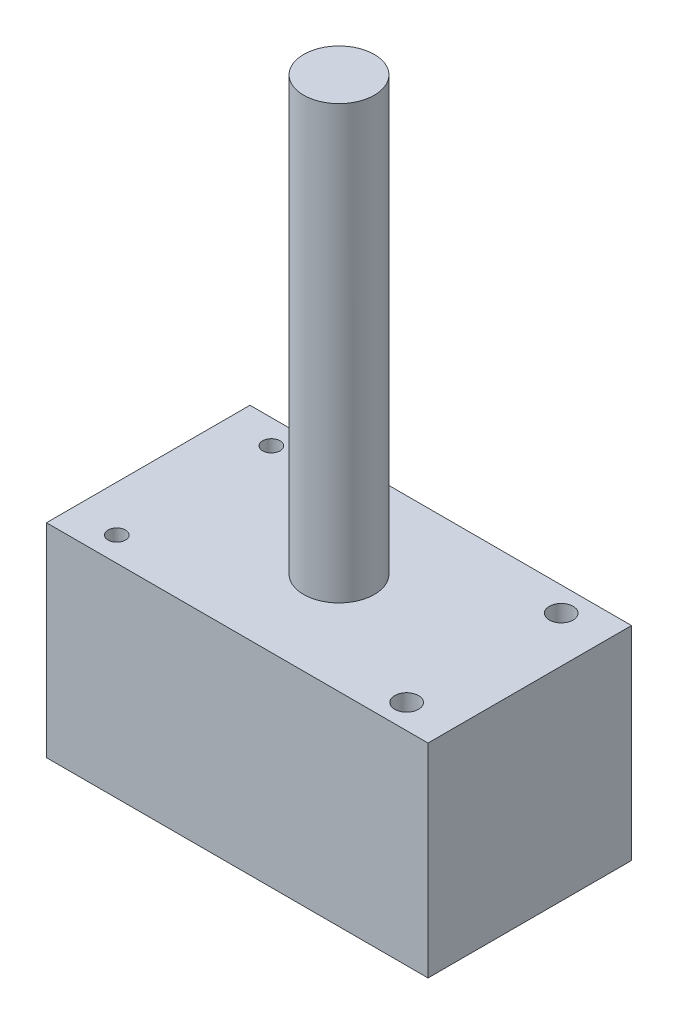
ISO-10303-21;
HEADER;
FILE_DESCRIPTION(('STEP AP214'),'2;1');
FILE_NAME('part.step','',(''),(''),'','','');
FILE_SCHEMA(('AUTOMOTIVE_DESIGN { 1 0 10303 214 1 1 1 1 }'));
ENDSEC;
DATA;
#1=APPLICATION_CONTEXT('core data for automotive mechanical design processes');
#2=APPLICATION_PROTOCOL_DEFINITION('international standard','automotive_design',2000,#1);
#3=PRODUCT_CONTEXT('',#1,'mechanical');
#4=PRODUCT('Part','Part','',(#3));
#5=PRODUCT_RELATED_PRODUCT_CATEGORY('part','',(#4));
#6=PRODUCT_DEFINITION_FORMATION('','',#4);
#7=PRODUCT_DEFINITION_CONTEXT('part definition',#1,'design');
#8=PRODUCT_DEFINITION('design','',#6,#7);
#9=PRODUCT_DEFINITION_SHAPE('','',#8);
#10=(LENGTH_UNIT() NAMED_UNIT(*) SI_UNIT(.MILLI.,.METRE.));
#11=(NAMED_UNIT(*) PLANE_ANGLE_UNIT() SI_UNIT($,.RADIAN.));
#12=(NAMED_UNIT(*) SI_UNIT($,.STERADIAN.) SOLID_ANGLE_UNIT());
#13=UNCERTAINTY_MEASURE_WITH_UNIT(LENGTH_MEASURE(1.E-05),#10,'distance_accuracy_value','');
#14=(GEOMETRIC_REPRESENTATION_CONTEXT(3) GLOBAL_UNCERTAINTY_ASSIGNED_CONTEXT((#13)) GLOBAL_UNIT_ASSIGNED_CONTEXT((#10,
#11,#12)) REPRESENTATION_CONTEXT('',''));
#15=CARTESIAN_POINT('',(0.,0.,0.));
#16=DIRECTION('',(0.,0.,1.));
#17=DIRECTION('',(1.,0.,0.));
#18=AXIS2_PLACEMENT_3D('',#15,#16,#17);
#19=CARTESIAN_POINT('',(0.,72.,0.));
#20=DIRECTION('',(0.,-1.,0.));
#21=DIRECTION('',(0.,0.,-1.));
#22=AXIS2_PLACEMENT_3D('',#19,#20,#21);
#23=PLANE('',#22);
#24=CARTESIAN_POINT('',(0.,72.,0.));
#25=DIRECTION('',(0.,-1.,0.));
#26=DIRECTION('',(0.,0.,-1.));
#27=AXIS2_PLACEMENT_3D('',#24,#25,#26);
#28=CIRCLE('',#27,12.5);
#29=CARTESIAN_POINT('',(0.,72.,-12.5));
#30=VERTEX_POINT('',#29);
#31=EDGE_CURVE('E11',#30,#30,#28,.F.);
#32=ORIENTED_EDGE('',*,*,#31,.F.);
#33=EDGE_LOOP('',(#32));
#34=FACE_BOUND('',#33,.T.);
#35=DIRECTION('',(0.,0.,-1.));
#36=VECTOR('',#35,1.);
#37=CARTESIAN_POINT('',(67.5,72.,36.));
#38=LINE('',#37,#36);
#39=CARTESIAN_POINT('',(67.5,72.,36.));
#40=VERTEX_POINT('',#39);
#41=CARTESIAN_POINT('',(67.5,72.,-36.));
#42=VERTEX_POINT('',#41);
#43=EDGE_CURVE('E93',#40,#42,#38,.T.);
#44=ORIENTED_EDGE('',*,*,#43,.T.);
#45=DIRECTION('',(-1.,0.,0.));
#46=VECTOR('',#45,1.);
#47=CARTESIAN_POINT('',(-67.5,72.,-36.));
#48=LINE('',#47,#46);
#49=CARTESIAN_POINT('',(-67.5,72.,-36.));
#50=VERTEX_POINT('',#49);
#51=EDGE_CURVE('E88',#42,#50,#48,.T.);
#52=ORIENTED_EDGE('',*,*,#51,.T.);
#53=DIRECTION('',(0.,0.,1.));
#54=VECTOR('',#53,1.);
#55=CARTESIAN_POINT('',(-67.5,72.,36.));
#56=LINE('',#55,#54);
#57=CARTESIAN_POINT('',(-67.5,72.,36.));
#58=VERTEX_POINT('',#57);
#59=EDGE_CURVE('E91',#50,#58,#56,.T.);
#60=ORIENTED_EDGE('',*,*,#59,.T.);
#61=DIRECTION('',(1.,0.,0.));
#62=VECTOR('',#61,1.);
#63=CARTESIAN_POINT('',(-67.5,72.,36.));
#64=LINE('',#63,#62);
#65=EDGE_CURVE('E57',#58,#40,#64,.T.);
#66=ORIENTED_EDGE('',*,*,#65,.T.);
#67=EDGE_LOOP('',(#44,#52,#60,#66));
#68=FACE_BOUND('',#67,.T.);
#69=CARTESIAN_POINT('',(-51.280276816609,72.,27.3494809688581));
#70=DIRECTION('',(0.,1.,0.));
#71=DIRECTION('',(0.,0.,1.));
#72=AXIS2_PLACEMENT_3D('',#69,#70,#71);
#73=CIRCLE('',#72,3.09047537804198);
#74=CARTESIAN_POINT('',(-51.280276816609,72.,30.4399563469001));
#75=VERTEX_POINT('',#74);
#76=EDGE_CURVE('E109',#75,#75,#73,.T.);
#77=ORIENTED_EDGE('',*,*,#76,.F.);
#78=EDGE_LOOP('',(#77));
#79=FACE_BOUND('',#78,.T.);
#80=CARTESIAN_POINT('',(51.2802768166091,72.,27.3494809688581));
#81=DIRECTION('',(0.,1.,0.));
#82=DIRECTION('',(0.,0.,1.));
#83=AXIS2_PLACEMENT_3D('',#80,#81,#82);
#84=CIRCLE('',#83,4.2197231833909);
#85=CARTESIAN_POINT('',(51.2802768166091,72.,31.569204152249));
#86=VERTEX_POINT('',#85);
#87=EDGE_CURVE('E124',#86,#86,#84,.T.);
#88=ORIENTED_EDGE('',*,*,#87,.F.);
#89=EDGE_LOOP('',(#88));
#90=FACE_BOUND('',#89,.T.);
#91=CARTESIAN_POINT('',(-51.280276816609,72.,-27.3494809688581));
#92=DIRECTION('',(0.,1.,0.));
#93=DIRECTION('',(0.,0.,1.));
#94=AXIS2_PLACEMENT_3D('',#91,#92,#93);
#95=CIRCLE('',#94,3.09047537804198);
#96=CARTESIAN_POINT('',(-51.280276816609,72.,-24.2590055908161));
#97=VERTEX_POINT('',#96);
#98=EDGE_CURVE('E130',#97,#97,#95,.T.);
#99=ORIENTED_EDGE('',*,*,#98,.F.);
#100=EDGE_LOOP('',(#99));
#101=FACE_BOUND('',#100,.T.);
#102=CARTESIAN_POINT('',(51.2802768166091,72.,-27.3494809688582));
#103=DIRECTION('',(0.,1.,0.));
#104=DIRECTION('',(0.,0.,1.));
#105=AXIS2_PLACEMENT_3D('',#102,#103,#104);
#106=CIRCLE('',#105,4.2197231833909);
#107=CARTESIAN_POINT('',(51.2802768166091,72.,-23.1297577854673));
#108=VERTEX_POINT('',#107);
#109=EDGE_CURVE('E136',#108,#108,#106,.T.);
#110=ORIENTED_EDGE('',*,*,#109,.F.);
#111=EDGE_LOOP('',(#110));
#112=FACE_BOUND('',#111,.T.);
#113=ADVANCED_FACE('F39',(#34,#68,#79,#90,#101,#112),#23,.F.);
#114=CARTESIAN_POINT('',(0.,0.,0.));
#115=DIRECTION('',(0.,-1.,0.));
#116=DIRECTION('',(0.,0.,-1.));
#117=AXIS2_PLACEMENT_3D('',#114,#115,#116);
#118=PLANE('',#117);
#119=CARTESIAN_POINT('',(-51.280276816609,0.,-27.3494809688581));
#120=DIRECTION('',(0.,1.,0.));
#121=DIRECTION('',(0.,0.,1.));
#122=AXIS2_PLACEMENT_3D('',#119,#120,#121);
#123=CIRCLE('',#122,3.09047537804198);
#124=CARTESIAN_POINT('',(-51.280276816609,0.,-24.2590055908161));
#125=VERTEX_POINT('',#124);
#126=EDGE_CURVE('E133',#125,#125,#123,.T.);
#127=ORIENTED_EDGE('',*,*,#126,.T.);
#128=EDGE_LOOP('',(#127));
#129=FACE_BOUND('',#128,.T.);
#130=CARTESIAN_POINT('',(-51.280276816609,0.,27.3494809688581));
#131=DIRECTION('',(0.,1.,0.));
#132=DIRECTION('',(0.,0.,1.));
#133=AXIS2_PLACEMENT_3D('',#130,#131,#132);
#134=CIRCLE('',#133,3.09047537804198);
#135=CARTESIAN_POINT('',(-51.280276816609,0.,30.4399563469001));
#136=VERTEX_POINT('',#135);
#137=EDGE_CURVE('E121',#136,#136,#134,.T.);
#138=ORIENTED_EDGE('',*,*,#137,.T.);
#139=EDGE_LOOP('',(#138));
#140=FACE_BOUND('',#139,.T.);
#141=DIRECTION('',(0.,0.,-1.));
#142=VECTOR('',#141,1.);
#143=CARTESIAN_POINT('',(67.5,0.,36.));
#144=LINE('',#143,#142);
#145=CARTESIAN_POINT('',(67.5,0.,36.));
#146=VERTEX_POINT('',#145);
#147=CARTESIAN_POINT('',(67.5,0.,-36.));
#148=VERTEX_POINT('',#147);
#149=EDGE_CURVE('E106',#146,#148,#144,.T.);
#150=ORIENTED_EDGE('',*,*,#149,.F.);
#151=DIRECTION('',(1.,0.,0.));
#152=VECTOR('',#151,1.);
#153=CARTESIAN_POINT('',(-67.5,0.,36.));
#154=LINE('',#153,#152);
#155=CARTESIAN_POINT('',(-67.5,0.,36.));
#156=VERTEX_POINT('',#155);
#157=EDGE_CURVE('E80',#156,#146,#154,.T.);
#158=ORIENTED_EDGE('',*,*,#157,.F.);
#159=DIRECTION('',(0.,0.,1.));
#160=VECTOR('',#159,1.);
#161=CARTESIAN_POINT('',(-67.5,0.,36.));
#162=LINE('',#161,#160);
#163=CARTESIAN_POINT('',(-67.5,0.,-36.));
#164=VERTEX_POINT('',#163);
#165=EDGE_CURVE('E74',#164,#156,#162,.T.);
#166=ORIENTED_EDGE('',*,*,#165,.F.);
#167=DIRECTION('',(-1.,0.,0.));
#168=VECTOR('',#167,1.);
#169=CARTESIAN_POINT('',(-67.5,0.,-36.));
#170=LINE('',#169,#168);
#171=EDGE_CURVE('E98',#148,#164,#170,.T.);
#172=ORIENTED_EDGE('',*,*,#171,.F.);
#173=EDGE_LOOP('',(#150,#158,#166,#172));
#174=FACE_BOUND('',#173,.T.);
#175=CARTESIAN_POINT('',(51.2802768166091,0.,27.3494809688581));
#176=DIRECTION('',(0.,1.,0.));
#177=DIRECTION('',(0.,0.,1.));
#178=AXIS2_PLACEMENT_3D('',#175,#176,#177);
#179=CIRCLE('',#178,4.2197231833909);
#180=CARTESIAN_POINT('',(51.2802768166091,0.,31.569204152249));
#181=VERTEX_POINT('',#180);
#182=EDGE_CURVE('E127',#181,#181,#179,.T.);
#183=ORIENTED_EDGE('',*,*,#182,.T.);
#184=EDGE_LOOP('',(#183));
#185=FACE_BOUND('',#184,.T.);
#186=CARTESIAN_POINT('',(51.2802768166091,0.,-27.3494809688582));
#187=DIRECTION('',(0.,1.,0.));
#188=DIRECTION('',(0.,0.,1.));
#189=AXIS2_PLACEMENT_3D('',#186,#187,#188);
#190=CIRCLE('',#189,4.2197231833909);
#191=CARTESIAN_POINT('',(51.2802768166091,0.,-23.1297577854673));
#192=VERTEX_POINT('',#191);
#193=EDGE_CURVE('E139',#192,#192,#190,.T.);
#194=ORIENTED_EDGE('',*,*,#193,.T.);
#195=EDGE_LOOP('',(#194));
#196=FACE_BOUND('',#195,.T.);
#197=ADVANCED_FACE('F117',(#129,#140,#174,#185,#196),#118,.T.);
#198=CARTESIAN_POINT('',(67.5,72.,36.));
#199=DIRECTION('',(-1.,0.,0.));
#200=DIRECTION('',(0.,0.,1.));
#201=AXIS2_PLACEMENT_3D('',#198,#199,#200);
#202=PLANE('',#201);
#203=ORIENTED_EDGE('',*,*,#149,.T.);
#204=DIRECTION('',(0.,-1.,0.));
#205=VECTOR('',#204,1.);
#206=CARTESIAN_POINT('',(67.5,72.,-36.));
#207=LINE('',#206,#205);
#208=EDGE_CURVE('E43',#42,#148,#207,.T.);
#209=ORIENTED_EDGE('',*,*,#208,.F.);
#210=ORIENTED_EDGE('',*,*,#43,.F.);
#211=DIRECTION('',(0.,-1.,0.));
#212=VECTOR('',#211,1.);
#213=CARTESIAN_POINT('',(67.5,72.,36.));
#214=LINE('',#213,#212);
#215=EDGE_CURVE('E102',#40,#146,#214,.T.);
#216=ORIENTED_EDGE('',*,*,#215,.T.);
#217=EDGE_LOOP('',(#203,#209,#210,#216));
#218=FACE_BOUND('',#217,.T.);
#219=ADVANCED_FACE('F41',(#218),#202,.F.);
#220=CARTESIAN_POINT('',(-67.5,72.,-36.));
#221=DIRECTION('',(0.,0.,1.));
#222=DIRECTION('',(1.,0.,0.));
#223=AXIS2_PLACEMENT_3D('',#220,#221,#222);
#224=PLANE('',#223);
#225=ORIENTED_EDGE('',*,*,#171,.T.);
#226=DIRECTION('',(0.,-1.,0.));
#227=VECTOR('',#226,1.);
#228=CARTESIAN_POINT('',(-67.5,72.,-36.));
#229=LINE('',#228,#227);
#230=EDGE_CURVE('E96',#50,#164,#229,.T.);
#231=ORIENTED_EDGE('',*,*,#230,.F.);
#232=ORIENTED_EDGE('',*,*,#51,.F.);
#233=ORIENTED_EDGE('',*,*,#208,.T.);
#234=EDGE_LOOP('',(#225,#231,#232,#233));
#235=FACE_BOUND('',#234,.T.);
#236=ADVANCED_FACE('F97',(#235),#224,.F.);
#237=CARTESIAN_POINT('',(-67.5,72.,36.));
#238=DIRECTION('',(1.,0.,0.));
#239=DIRECTION('',(0.,0.,-1.));
#240=AXIS2_PLACEMENT_3D('',#237,#238,#239);
#241=PLANE('',#240);
#242=ORIENTED_EDGE('',*,*,#165,.T.);
#243=DIRECTION('',(0.,-1.,0.));
#244=VECTOR('',#243,1.);
#245=CARTESIAN_POINT('',(-67.5,72.,36.));
#246=LINE('',#245,#244);
#247=EDGE_CURVE('E99',#58,#156,#246,.T.);
#248=ORIENTED_EDGE('',*,*,#247,.F.);
#249=ORIENTED_EDGE('',*,*,#59,.F.);
#250=ORIENTED_EDGE('',*,*,#230,.T.);
#251=EDGE_LOOP('',(#242,#248,#249,#250));
#252=FACE_BOUND('',#251,.T.);
#253=ADVANCED_FACE('F100',(#252),#241,.F.);
#254=CARTESIAN_POINT('',(-67.5,72.,36.));
#255=DIRECTION('',(0.,0.,-1.));
#256=DIRECTION('',(-1.,0.,0.));
#257=AXIS2_PLACEMENT_3D('',#254,#255,#256);
#258=PLANE('',#257);
#259=ORIENTED_EDGE('',*,*,#157,.T.);
#260=ORIENTED_EDGE('',*,*,#215,.F.);
#261=ORIENTED_EDGE('',*,*,#65,.F.);
#262=ORIENTED_EDGE('',*,*,#247,.T.);
#263=EDGE_LOOP('',(#259,#260,#261,#262));
#264=FACE_BOUND('',#263,.T.);
#265=ADVANCED_FACE('F114',(#264),#258,.F.);
#266=CARTESIAN_POINT('',(-51.280276816609,72.,27.3494809688581));
#267=DIRECTION('',(0.,-1.,0.));
#268=DIRECTION('',(0.,0.,-1.));
#269=AXIS2_PLACEMENT_3D('',#266,#267,#268);
#270=CYLINDRICAL_SURFACE('',#269,3.09047537804198);
#271=ORIENTED_EDGE('',*,*,#76,.T.);
#272=EDGE_LOOP('',(#271));
#273=FACE_BOUND('',#272,.T.);
#274=ORIENTED_EDGE('',*,*,#137,.F.);
#275=EDGE_LOOP('',(#274));
#276=FACE_BOUND('',#275,.T.);
#277=ADVANCED_FACE('F165',(#273,#276),#270,.F.);
#278=CARTESIAN_POINT('',(51.2802768166091,72.,27.3494809688581));
#279=DIRECTION('',(0.,-1.,0.));
#280=DIRECTION('',(0.,0.,-1.));
#281=AXIS2_PLACEMENT_3D('',#278,#279,#280);
#282=CYLINDRICAL_SURFACE('',#281,4.2197231833909);
#283=ORIENTED_EDGE('',*,*,#87,.T.);
#284=EDGE_LOOP('',(#283));
#285=FACE_BOUND('',#284,.T.);
#286=ORIENTED_EDGE('',*,*,#182,.F.);
#287=EDGE_LOOP('',(#286));
#288=FACE_BOUND('',#287,.T.);
#289=ADVANCED_FACE('F221',(#285,#288),#282,.F.);
#290=CARTESIAN_POINT('',(-51.280276816609,72.,-27.3494809688581));
#291=DIRECTION('',(0.,-1.,0.));
#292=DIRECTION('',(0.,0.,-1.));
#293=AXIS2_PLACEMENT_3D('',#290,#291,#292);
#294=CYLINDRICAL_SURFACE('',#293,3.09047537804198);
#295=ORIENTED_EDGE('',*,*,#98,.T.);
#296=EDGE_LOOP('',(#295));
#297=FACE_BOUND('',#296,.T.);
#298=ORIENTED_EDGE('',*,*,#126,.F.);
#299=EDGE_LOOP('',(#298));
#300=FACE_BOUND('',#299,.T.);
#301=ADVANCED_FACE('F212',(#297,#300),#294,.F.);
#302=CARTESIAN_POINT('',(51.2802768166091,72.,-27.3494809688582));
#303=DIRECTION('',(0.,-1.,0.));
#304=DIRECTION('',(0.,0.,-1.));
#305=AXIS2_PLACEMENT_3D('',#302,#303,#304);
#306=CYLINDRICAL_SURFACE('',#305,4.2197231833909);
#307=ORIENTED_EDGE('',*,*,#109,.T.);
#308=EDGE_LOOP('',(#307));
#309=FACE_BOUND('',#308,.T.);
#310=ORIENTED_EDGE('',*,*,#193,.F.);
#311=EDGE_LOOP('',(#310));
#312=FACE_BOUND('',#311,.T.);
#313=ADVANCED_FACE('F153',(#309,#312),#306,.F.);
#314=CARTESIAN_POINT('',(0.,225.,0.));
#315=DIRECTION('',(0.,-1.,0.));
#316=DIRECTION('',(0.,0.,-1.));
#317=AXIS2_PLACEMENT_3D('',#314,#315,#316);
#318=CYLINDRICAL_SURFACE('',#317,12.5);
#319=CARTESIAN_POINT('',(0.,225.,0.));
#320=DIRECTION('',(0.,1.,0.));
#321=DIRECTION('',(0.,0.,1.));
#322=AXIS2_PLACEMENT_3D('',#319,#320,#321);
#323=CIRCLE('',#322,12.5);
#324=CARTESIAN_POINT('',(0.,225.,12.5));
#325=VERTEX_POINT('',#324);
#326=EDGE_CURVE('E142',#325,#325,#323,.T.);
#327=ORIENTED_EDGE('',*,*,#326,.F.);
#328=EDGE_LOOP('',(#327));
#329=FACE_BOUND('',#328,.T.);
#330=ORIENTED_EDGE('',*,*,#31,.T.);
#331=EDGE_LOOP('',(#330));
#332=FACE_BOUND('',#331,.T.);
#333=ADVANCED_FACE('F150',(#329,#332),#318,.T.);
#334=CARTESIAN_POINT('',(0.,225.,0.));
#335=DIRECTION('',(0.,1.,0.));
#336=DIRECTION('',(0.,0.,1.));
#337=AXIS2_PLACEMENT_3D('',#334,#335,#336);
#338=PLANE('',#337);
#339=ORIENTED_EDGE('',*,*,#326,.T.);
#340=EDGE_LOOP('',(#339));
#341=FACE_BOUND('',#340,.T.);
#342=ADVANCED_FACE('F148',(#341),#338,.T.);
#343=CLOSED_SHELL('',(#113,#197,#219,#236,#253,#265,#277,#289,#301,#313,#333,#342));
#344=MANIFOLD_SOLID_BREP('B2',#343);
#345=ADVANCED_BREP_SHAPE_REPRESENTATION('',(#18,#344),#14);
#346=SHAPE_DEFINITION_REPRESENTATION(#9,#345);
ENDSEC;
END-ISO-10303-21;
